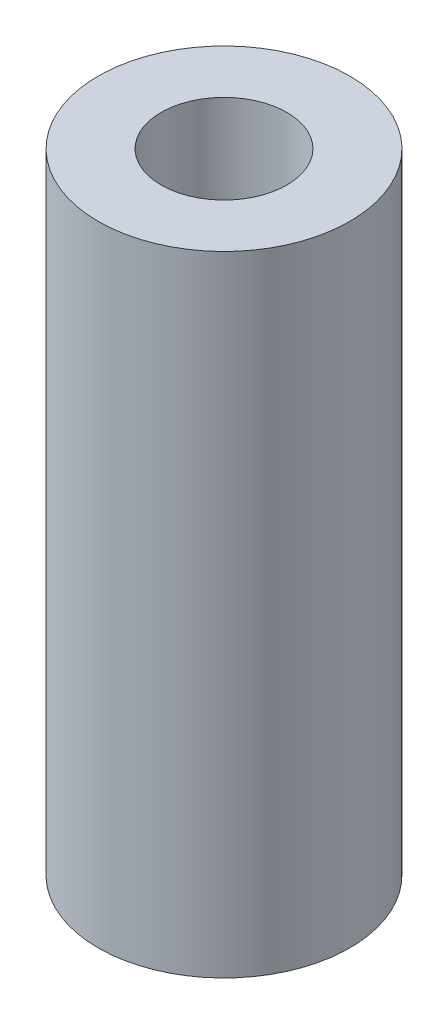
ISO-10303-21;
HEADER;
FILE_DESCRIPTION(('STEP AP214'),'2;1');
FILE_NAME('part.step','',(''),(''),'','','');
FILE_SCHEMA(('AUTOMOTIVE_DESIGN { 1 0 10303 214 1 1 1 1 }'));
ENDSEC;
DATA;
#1=APPLICATION_CONTEXT('core data for automotive mechanical design processes');
#2=APPLICATION_PROTOCOL_DEFINITION('international standard','automotive_design',2000,#1);
#3=PRODUCT_CONTEXT('',#1,'mechanical');
#4=PRODUCT('Part','Part','',(#3));
#5=PRODUCT_RELATED_PRODUCT_CATEGORY('part','',(#4));
#6=PRODUCT_DEFINITION_FORMATION('','',#4);
#7=PRODUCT_DEFINITION_CONTEXT('part definition',#1,'design');
#8=PRODUCT_DEFINITION('design','',#6,#7);
#9=PRODUCT_DEFINITION_SHAPE('','',#8);
#10=(LENGTH_UNIT() NAMED_UNIT(*) SI_UNIT(.MILLI.,.METRE.));
#11=(NAMED_UNIT(*) PLANE_ANGLE_UNIT() SI_UNIT($,.RADIAN.));
#12=(NAMED_UNIT(*) SI_UNIT($,.STERADIAN.) SOLID_ANGLE_UNIT());
#13=UNCERTAINTY_MEASURE_WITH_UNIT(LENGTH_MEASURE(1.E-05),#10,'distance_accuracy_value','');
#14=(GEOMETRIC_REPRESENTATION_CONTEXT(3) GLOBAL_UNCERTAINTY_ASSIGNED_CONTEXT((#13)) GLOBAL_UNIT_ASSIGNED_CONTEXT((#10,
#11,#12)) REPRESENTATION_CONTEXT('',''));
#15=CARTESIAN_POINT('',(0.,0.,0.));
#16=DIRECTION('',(0.,0.,1.));
#17=DIRECTION('',(1.,0.,0.));
#18=AXIS2_PLACEMENT_3D('',#15,#16,#17);
#19=CARTESIAN_POINT('',(0.,30.,0.));
#20=DIRECTION('',(0.,1.,0.));
#21=DIRECTION('',(0.,0.,1.));
#22=AXIS2_PLACEMENT_3D('',#19,#20,#21);
#23=PLANE('',#22);
#24=CARTESIAN_POINT('',(0.,30.,0.));
#25=DIRECTION('',(0.,1.,0.));
#26=DIRECTION('',(0.,0.,1.));
#27=AXIS2_PLACEMENT_3D('',#24,#25,#26);
#28=CIRCLE('',#27,6.);
#29=CARTESIAN_POINT('',(0.,30.,6.));
#30=VERTEX_POINT('',#29);
#31=EDGE_CURVE('E10',#30,#30,#28,.T.);
#32=ORIENTED_EDGE('',*,*,#31,.T.);
#33=EDGE_LOOP('',(#32));
#34=FACE_BOUND('',#33,.T.);
#35=CARTESIAN_POINT('',(0.,30.,0.));
#36=DIRECTION('',(0.,1.,0.));
#37=DIRECTION('',(0.,0.,1.));
#38=AXIS2_PLACEMENT_3D('',#35,#36,#37);
#39=CIRCLE('',#38,3.);
#40=CARTESIAN_POINT('',(0.,30.,3.));
#41=VERTEX_POINT('',#40);
#42=EDGE_CURVE('E41',#41,#41,#39,.T.);
#43=ORIENTED_EDGE('',*,*,#42,.F.);
#44=EDGE_LOOP('',(#43));
#45=FACE_BOUND('',#44,.T.);
#46=ADVANCED_FACE('F30',(#34,#45),#23,.T.);
#47=CARTESIAN_POINT('',(0.,0.,0.));
#48=DIRECTION('',(0.,1.,0.));
#49=DIRECTION('',(0.,0.,1.));
#50=AXIS2_PLACEMENT_3D('',#47,#48,#49);
#51=PLANE('',#50);
#52=CARTESIAN_POINT('',(0.,0.,0.));
#53=DIRECTION('',(0.,1.,0.));
#54=DIRECTION('',(0.,0.,1.));
#55=AXIS2_PLACEMENT_3D('',#52,#53,#54);
#56=CIRCLE('',#55,6.);
#57=CARTESIAN_POINT('',(0.,0.,6.));
#58=VERTEX_POINT('',#57);
#59=EDGE_CURVE('E34',#58,#58,#56,.T.);
#60=ORIENTED_EDGE('',*,*,#59,.F.);
#61=EDGE_LOOP('',(#60));
#62=FACE_BOUND('',#61,.T.);
#63=CARTESIAN_POINT('',(0.,0.,0.));
#64=DIRECTION('',(0.,1.,0.));
#65=DIRECTION('',(0.,0.,1.));
#66=AXIS2_PLACEMENT_3D('',#63,#64,#65);
#67=CIRCLE('',#66,3.);
#68=CARTESIAN_POINT('',(0.,0.,3.));
#69=VERTEX_POINT('',#68);
#70=EDGE_CURVE('E43',#69,#69,#67,.T.);
#71=ORIENTED_EDGE('',*,*,#70,.T.);
#72=EDGE_LOOP('',(#71));
#73=FACE_BOUND('',#72,.T.);
#74=ADVANCED_FACE('F53',(#62,#73),#51,.F.);
#75=CARTESIAN_POINT('',(0.,30.,0.));
#76=DIRECTION('',(0.,-1.,0.));
#77=DIRECTION('',(0.,0.,-1.));
#78=AXIS2_PLACEMENT_3D('',#75,#76,#77);
#79=CYLINDRICAL_SURFACE('',#78,6.);
#80=ORIENTED_EDGE('',*,*,#31,.F.);
#81=EDGE_LOOP('',(#80));
#82=FACE_BOUND('',#81,.T.);
#83=ORIENTED_EDGE('',*,*,#59,.T.);
#84=EDGE_LOOP('',(#83));
#85=FACE_BOUND('',#84,.T.);
#86=ADVANCED_FACE('F32',(#82,#85),#79,.T.);
#87=CARTESIAN_POINT('',(0.,30.,0.));
#88=DIRECTION('',(0.,-1.,0.));
#89=DIRECTION('',(0.,0.,-1.));
#90=AXIS2_PLACEMENT_3D('',#87,#88,#89);
#91=CYLINDRICAL_SURFACE('',#90,3.);
#92=ORIENTED_EDGE('',*,*,#42,.T.);
#93=EDGE_LOOP('',(#92));
#94=FACE_BOUND('',#93,.T.);
#95=ORIENTED_EDGE('',*,*,#70,.F.);
#96=EDGE_LOOP('',(#95));
#97=FACE_BOUND('',#96,.T.);
#98=ADVANCED_FACE('F49',(#94,#97),#91,.F.);
#99=CLOSED_SHELL('',(#46,#74,#86,#98));
#100=MANIFOLD_SOLID_BREP('B2',#99);
#101=ADVANCED_BREP_SHAPE_REPRESENTATION('',(#18,#100),#14);
#102=SHAPE_DEFINITION_REPRESENTATION(#9,#101);
ENDSEC;
END-ISO-10303-21;
